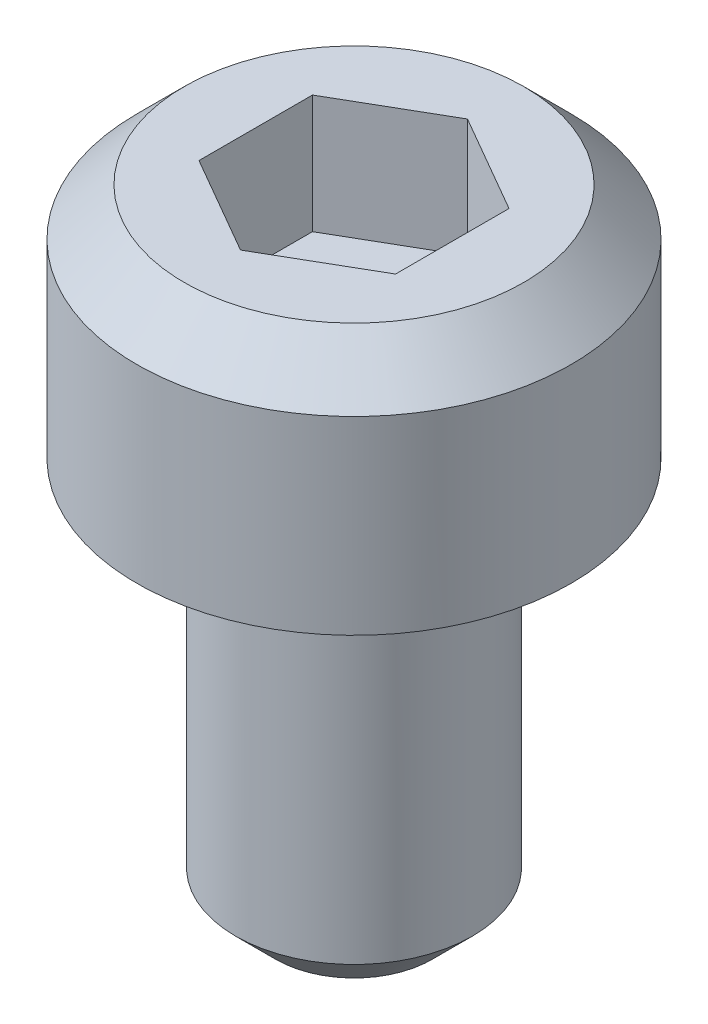
ISO-10303-21;
HEADER;
FILE_DESCRIPTION(('STEP AP214'),'2;1');
FILE_NAME('part.step','',(''),(''),'','','');
FILE_SCHEMA(('AUTOMOTIVE_DESIGN { 1 0 10303 214 1 1 1 1 }'));
ENDSEC;
DATA;
#1=APPLICATION_CONTEXT('core data for automotive mechanical design processes');
#2=APPLICATION_PROTOCOL_DEFINITION('international standard','automotive_design',2000,#1);
#3=PRODUCT_CONTEXT('',#1,'mechanical');
#4=PRODUCT('Part','Part','',(#3));
#5=PRODUCT_RELATED_PRODUCT_CATEGORY('part','',(#4));
#6=PRODUCT_DEFINITION_FORMATION('','',#4);
#7=PRODUCT_DEFINITION_CONTEXT('part definition',#1,'design');
#8=PRODUCT_DEFINITION('design','',#6,#7);
#9=PRODUCT_DEFINITION_SHAPE('','',#8);
#10=(LENGTH_UNIT() NAMED_UNIT(*) SI_UNIT(.MILLI.,.METRE.));
#11=(NAMED_UNIT(*) PLANE_ANGLE_UNIT() SI_UNIT($,.RADIAN.));
#12=(NAMED_UNIT(*) SI_UNIT($,.STERADIAN.) SOLID_ANGLE_UNIT());
#13=UNCERTAINTY_MEASURE_WITH_UNIT(LENGTH_MEASURE(1.E-05),#10,'distance_accuracy_value','');
#14=(GEOMETRIC_REPRESENTATION_CONTEXT(3) GLOBAL_UNCERTAINTY_ASSIGNED_CONTEXT((#13)) GLOBAL_UNIT_ASSIGNED_CONTEXT((#10,
#11,#12)) REPRESENTATION_CONTEXT('',''));
#15=CARTESIAN_POINT('',(0.,0.,0.));
#16=DIRECTION('',(0.,0.,1.));
#17=DIRECTION('',(1.,0.,0.));
#18=AXIS2_PLACEMENT_3D('',#15,#16,#17);
#19=CARTESIAN_POINT('',(-183.675462515959,-340.786781413598,-1451.00674798632));
#20=DIRECTION('',(0.,1.,0.));
#21=DIRECTION('',(-1.,0.,0.));
#22=AXIS2_PLACEMENT_3D('',#19,#20,#21);
#23=PLANE('',#22);
#24=DIRECTION('',(0.866025403784317,0.,0.50000000000021));
#25=VECTOR('',#24,1.);
#26=CARTESIAN_POINT('',(-184.920062515959,-340.786781413598,-1450.28817784128));
#27=LINE('',#26,#25);
#28=CARTESIAN_POINT('',(-184.920062515959,-340.786781413598,-1450.28817784128));
#29=VERTEX_POINT('',#28);
#30=CARTESIAN_POINT('',(-183.675462515959,-340.786781413598,-1449.56960769625));
#31=VERTEX_POINT('',#30);
#32=EDGE_CURVE('E129',#29,#31,#27,.T.);
#33=ORIENTED_EDGE('',*,*,#32,.T.);
#34=DIRECTION('',(0.866025403784317,0.,-0.50000000000021));
#35=VECTOR('',#34,1.);
#36=CARTESIAN_POINT('',(-183.675462515959,-340.786781413598,-1449.56960769625));
#37=LINE('',#36,#35);
#38=CARTESIAN_POINT('',(-182.430862515958,-340.786781413598,-1450.28817784129));
#39=VERTEX_POINT('',#38);
#40=EDGE_CURVE('E133',#31,#39,#37,.T.);
#41=ORIENTED_EDGE('',*,*,#40,.T.);
#42=DIRECTION('',(0.,0.,1.));
#43=VECTOR('',#42,1.);
#44=CARTESIAN_POINT('',(-182.430862515959,-340.786781413598,-1450.28817784128));
#45=LINE('',#44,#43);
#46=CARTESIAN_POINT('',(-182.430862515959,-340.786781413598,-1451.72531813135));
#47=VERTEX_POINT('',#46);
#48=EDGE_CURVE('E84',#39,#47,#45,.F.);
#49=ORIENTED_EDGE('',*,*,#48,.T.);
#50=DIRECTION('',(-0.866025403784317,0.,-0.50000000000021));
#51=VECTOR('',#50,1.);
#52=CARTESIAN_POINT('',(-182.430862515959,-340.786781413598,-1451.72531813135));
#53=LINE('',#52,#51);
#54=CARTESIAN_POINT('',(-183.67546251596,-340.786781413598,-1452.44388827639));
#55=VERTEX_POINT('',#54);
#56=EDGE_CURVE('E67',#47,#55,#53,.T.);
#57=ORIENTED_EDGE('',*,*,#56,.T.);
#58=DIRECTION('',(-0.866025403784317,0.,0.50000000000021));
#59=VECTOR('',#58,1.);
#60=CARTESIAN_POINT('',(-183.675462515959,-340.786781413598,-1452.44388827639));
#61=LINE('',#60,#59);
#62=CARTESIAN_POINT('',(-184.92006251596,-340.786781413598,-1451.72531813135));
#63=VERTEX_POINT('',#62);
#64=EDGE_CURVE('E72',#55,#63,#61,.T.);
#65=ORIENTED_EDGE('',*,*,#64,.T.);
#66=DIRECTION('',(0.,0.,1.));
#67=VECTOR('',#66,1.);
#68=CARTESIAN_POINT('',(-184.920062515959,-340.786781413598,-1451.72531813135));
#69=LINE('',#68,#67);
#70=EDGE_CURVE('E125',#63,#29,#69,.T.);
#71=ORIENTED_EDGE('',*,*,#70,.T.);
#72=EDGE_LOOP('',(#33,#41,#49,#57,#65,#71));
#73=FACE_BOUND('',#72,.T.);
#74=ADVANCED_FACE('F17',(#73),#23,.T.);
#75=CARTESIAN_POINT('',(-183.675462515959,-339.288181413598,-1452.44388827639));
#76=DIRECTION('',(-0.50000000000021,0.,-0.866025403784317));
#77=DIRECTION('',(-0.866025403784317,0.,0.50000000000021));
#78=AXIS2_PLACEMENT_3D('',#75,#76,#77);
#79=PLANE('',#78);
#80=DIRECTION('',(0.,1.,0.));
#81=VECTOR('',#80,1.);
#82=CARTESIAN_POINT('',(-183.675462515962,-339.288181413598,-1452.44388827639));
#83=LINE('',#82,#81);
#84=CARTESIAN_POINT('',(-183.67546251596,-339.288181413598,-1452.44388827639));
#85=VERTEX_POINT('',#84);
#86=EDGE_CURVE('E74',#55,#85,#83,.T.);
#87=ORIENTED_EDGE('',*,*,#86,.T.);
#88=DIRECTION('',(0.86602540378243,0.,-0.500000000003479));
#89=VECTOR('',#88,1.);
#90=CARTESIAN_POINT('',(-184.920062515959,-339.288181413598,-1451.72531813135));
#91=LINE('',#90,#89);
#92=CARTESIAN_POINT('',(-184.92006251596,-339.288181413598,-1451.72531813135));
#93=VERTEX_POINT('',#92);
#94=EDGE_CURVE('E123',#93,#85,#91,.T.);
#95=ORIENTED_EDGE('',*,*,#94,.F.);
#96=DIRECTION('',(0.,-1.,0.));
#97=VECTOR('',#96,1.);
#98=CARTESIAN_POINT('',(-184.920062515959,-339.288181413598,-1451.72531813135));
#99=LINE('',#98,#97);
#100=EDGE_CURVE('E77',#93,#63,#99,.T.);
#101=ORIENTED_EDGE('',*,*,#100,.T.);
#102=ORIENTED_EDGE('',*,*,#64,.F.);
#103=EDGE_LOOP('',(#87,#95,#101,#102));
#104=FACE_BOUND('',#103,.T.);
#105=ADVANCED_FACE('F73',(#104),#79,.F.);
#106=CARTESIAN_POINT('',(-182.430862515959,-339.288181413598,-1451.72531813135));
#107=DIRECTION('',(0.50000000000021,0.,-0.866025403784317));
#108=DIRECTION('',(-0.866025403784317,0.,-0.50000000000021));
#109=AXIS2_PLACEMENT_3D('',#106,#107,#108);
#110=PLANE('',#109);
#111=DIRECTION('',(0.,1.,0.));
#112=VECTOR('',#111,1.);
#113=CARTESIAN_POINT('',(-182.430862515959,-339.288181413598,-1451.72531813135));
#114=LINE('',#113,#112);
#115=CARTESIAN_POINT('',(-182.430862515959,-339.288181413598,-1451.72531813135));
#116=VERTEX_POINT('',#115);
#117=EDGE_CURVE('E86',#47,#116,#114,.T.);
#118=ORIENTED_EDGE('',*,*,#117,.T.);
#119=DIRECTION('',(0.866025403782435,0.,0.50000000000347));
#120=VECTOR('',#119,1.);
#121=CARTESIAN_POINT('',(-183.675462515959,-339.288181413598,-1452.44388827639));
#122=LINE('',#121,#120);
#123=EDGE_CURVE('E90',#85,#116,#122,.T.);
#124=ORIENTED_EDGE('',*,*,#123,.F.);
#125=ORIENTED_EDGE('',*,*,#86,.F.);
#126=ORIENTED_EDGE('',*,*,#56,.F.);
#127=EDGE_LOOP('',(#118,#124,#125,#126));
#128=FACE_BOUND('',#127,.T.);
#129=ADVANCED_FACE('F88',(#128),#110,.F.);
#130=CARTESIAN_POINT('',(-182.430862515959,-339.288181413598,-1450.28817784128));
#131=DIRECTION('',(1.,0.,0.));
#132=DIRECTION('',(0.,1.,0.));
#133=AXIS2_PLACEMENT_3D('',#130,#131,#132);
#134=PLANE('',#133);
#135=DIRECTION('',(0.,1.,0.));
#136=VECTOR('',#135,1.);
#137=CARTESIAN_POINT('',(-182.430862515956,-339.288181413598,-1450.28817784129));
#138=LINE('',#137,#136);
#139=CARTESIAN_POINT('',(-182.430862515958,-339.288181413598,-1450.28817784129));
#140=VERTEX_POINT('',#139);
#141=EDGE_CURVE('E135',#39,#140,#138,.T.);
#142=ORIENTED_EDGE('',*,*,#141,.T.);
#143=DIRECTION('',(0.,0.,1.));
#144=VECTOR('',#143,1.);
#145=CARTESIAN_POINT('',(-182.430862515959,-339.288181413598,-1451.00674798632));
#146=LINE('',#145,#144);
#147=EDGE_CURVE('E119',#116,#140,#146,.T.);
#148=ORIENTED_EDGE('',*,*,#147,.F.);
#149=ORIENTED_EDGE('',*,*,#117,.F.);
#150=ORIENTED_EDGE('',*,*,#48,.F.);
#151=EDGE_LOOP('',(#142,#148,#149,#150));
#152=FACE_BOUND('',#151,.T.);
#153=ADVANCED_FACE('F139',(#152),#134,.F.);
#154=CARTESIAN_POINT('',(-183.675462515959,-339.288181413598,-1449.56960769625));
#155=DIRECTION('',(0.50000000000021,0.,0.866025403784317));
#156=DIRECTION('',(0.866025403784317,0.,-0.50000000000021));
#157=AXIS2_PLACEMENT_3D('',#154,#155,#156);
#158=PLANE('',#157);
#159=DIRECTION('',(0.,1.,0.));
#160=VECTOR('',#159,1.);
#161=CARTESIAN_POINT('',(-183.675462515961,-339.288181413598,-1449.56960769625));
#162=LINE('',#161,#160);
#163=CARTESIAN_POINT('',(-183.675462515959,-339.288181413598,-1449.56960769625));
#164=VERTEX_POINT('',#163);
#165=EDGE_CURVE('E131',#31,#164,#162,.T.);
#166=ORIENTED_EDGE('',*,*,#165,.T.);
#167=DIRECTION('',(-0.866025403782435,0.,0.50000000000347));
#168=VECTOR('',#167,1.);
#169=CARTESIAN_POINT('',(-182.430862515959,-339.288181413598,-1450.28817784129));
#170=LINE('',#169,#168);
#171=EDGE_CURVE('E116',#140,#164,#170,.T.);
#172=ORIENTED_EDGE('',*,*,#171,.F.);
#173=ORIENTED_EDGE('',*,*,#141,.F.);
#174=ORIENTED_EDGE('',*,*,#40,.F.);
#175=EDGE_LOOP('',(#166,#172,#173,#174));
#176=FACE_BOUND('',#175,.T.);
#177=ADVANCED_FACE('F150',(#176),#158,.F.);
#178=CARTESIAN_POINT('',(-184.920062515959,-339.288181413598,-1450.28817784128));
#179=DIRECTION('',(-0.50000000000021,0.,0.866025403784317));
#180=DIRECTION('',(0.866025403784317,0.,0.50000000000021));
#181=AXIS2_PLACEMENT_3D('',#178,#179,#180);
#182=PLANE('',#181);
#183=DIRECTION('',(0.,-1.,0.));
#184=VECTOR('',#183,1.);
#185=CARTESIAN_POINT('',(-184.920062515959,-339.288181413598,-1450.28817784128));
#186=LINE('',#185,#184);
#187=CARTESIAN_POINT('',(-184.920062515959,-339.288181413598,-1450.28817784128));
#188=VERTEX_POINT('',#187);
#189=EDGE_CURVE('E35',#29,#188,#186,.F.);
#190=ORIENTED_EDGE('',*,*,#189,.T.);
#191=DIRECTION('',(-0.866025403785441,0.,-0.499999999998264));
#192=VECTOR('',#191,1.);
#193=CARTESIAN_POINT('',(-183.675462515959,-339.288181413598,-1449.56960769625));
#194=LINE('',#193,#192);
#195=EDGE_CURVE('E113',#164,#188,#194,.T.);
#196=ORIENTED_EDGE('',*,*,#195,.F.);
#197=ORIENTED_EDGE('',*,*,#165,.F.);
#198=ORIENTED_EDGE('',*,*,#32,.F.);
#199=EDGE_LOOP('',(#190,#196,#197,#198));
#200=FACE_BOUND('',#199,.T.);
#201=ADVANCED_FACE('F148',(#200),#182,.F.);
#202=CARTESIAN_POINT('',(-184.920062515959,-339.288181413598,-1451.72531813135));
#203=DIRECTION('',(-1.,0.,0.));
#204=DIRECTION('',(0.,-1.,0.));
#205=AXIS2_PLACEMENT_3D('',#202,#203,#204);
#206=PLANE('',#205);
#207=ORIENTED_EDGE('',*,*,#100,.F.);
#208=DIRECTION('',(0.,0.,1.));
#209=VECTOR('',#208,1.);
#210=CARTESIAN_POINT('',(-184.920062515959,-339.288181413598,-1451.00674798632));
#211=LINE('',#210,#209);
#212=EDGE_CURVE('E109',#188,#93,#211,.F.);
#213=ORIENTED_EDGE('',*,*,#212,.F.);
#214=ORIENTED_EDGE('',*,*,#189,.F.);
#215=ORIENTED_EDGE('',*,*,#70,.F.);
#216=EDGE_LOOP('',(#207,#213,#214,#215));
#217=FACE_BOUND('',#216,.T.);
#218=ADVANCED_FACE('F146',(#217),#206,.F.);
#219=CARTESIAN_POINT('',(-183.675462515959,-339.288181413598,-1451.00674798632));
#220=DIRECTION('',(0.,1.,0.));
#221=DIRECTION('',(-1.,0.,0.));
#222=AXIS2_PLACEMENT_3D('',#219,#220,#221);
#223=PLANE('',#222);
#224=ORIENTED_EDGE('',*,*,#195,.T.);
#225=ORIENTED_EDGE('',*,*,#212,.T.);
#226=ORIENTED_EDGE('',*,*,#94,.T.);
#227=ORIENTED_EDGE('',*,*,#123,.T.);
#228=ORIENTED_EDGE('',*,*,#147,.T.);
#229=ORIENTED_EDGE('',*,*,#171,.T.);
#230=EDGE_LOOP('',(#224,#225,#226,#227,#228,#229));
#231=FACE_BOUND('',#230,.T.);
#232=CARTESIAN_POINT('',(-183.675462515959,-339.288181413591,-1451.00674798632));
#233=DIRECTION('',(0.,-1.,0.));
#234=DIRECTION('',(0.,0.,-1.));
#235=AXIS2_PLACEMENT_3D('',#232,#233,#234);
#236=CIRCLE('',#235,2.14960199997405);
#237=CARTESIAN_POINT('',(-183.675462515959,-339.288181413591,-1453.15634998629));
#238=VERTEX_POINT('',#237);
#239=EDGE_CURVE('E20',#238,#238,#236,.T.);
#240=ORIENTED_EDGE('',*,*,#239,.F.);
#241=EDGE_LOOP('',(#240));
#242=FACE_BOUND('',#241,.T.);
#243=ADVANCED_FACE('F143',(#231,#242),#223,.T.);
#244=CARTESIAN_POINT('',(-183.675462515959,-339.888129413607,-1451.00674798632));
#245=DIRECTION('',(0.,-1.,0.));
#246=DIRECTION('',(0.,0.,-1.));
#247=AXIS2_PLACEMENT_3D('',#244,#245,#246);
#248=CONICAL_SURFACE('',#247,2.7495499999905,0.785398163397448);
#249=ORIENTED_EDGE('',*,*,#239,.T.);
#250=EDGE_LOOP('',(#249));
#251=FACE_BOUND('',#250,.T.);
#252=CARTESIAN_POINT('',(-183.675462515959,-339.888129413617,-1451.00674798632));
#253=DIRECTION('',(0.,1.,0.));
#254=DIRECTION('',(-1.,0.,0.));
#255=AXIS2_PLACEMENT_3D('',#252,#253,#254);
#256=CIRCLE('',#255,2.74955);
#257=CARTESIAN_POINT('',(-186.425012515959,-339.888129413617,-1451.00674798632));
#258=VERTEX_POINT('',#257);
#259=EDGE_CURVE('E101',#258,#258,#256,.F.);
#260=ORIENTED_EDGE('',*,*,#259,.F.);
#261=EDGE_LOOP('',(#260));
#262=FACE_BOUND('',#261,.T.);
#263=ADVANCED_FACE('F183',(#251,#262),#248,.T.);
#264=CARTESIAN_POINT('',(-183.675462515959,-342.287921413598,-1451.00674798632));
#265=DIRECTION('',(0.,1.,0.));
#266=DIRECTION('',(-1.,0.,0.));
#267=AXIS2_PLACEMENT_3D('',#264,#265,#266);
#268=CYLINDRICAL_SURFACE('',#267,2.74955);
#269=ORIENTED_EDGE('',*,*,#259,.T.);
#270=EDGE_LOOP('',(#269));
#271=FACE_BOUND('',#270,.T.);
#272=CARTESIAN_POINT('',(-183.675462515959,-342.287921413598,-1451.00674798632));
#273=DIRECTION('',(0.,1.,0.));
#274=DIRECTION('',(-1.,0.,0.));
#275=AXIS2_PLACEMENT_3D('',#272,#273,#274);
#276=CIRCLE('',#275,2.74955);
#277=CARTESIAN_POINT('',(-186.425012515959,-342.287921413598,-1451.00674798632));
#278=VERTEX_POINT('',#277);
#279=EDGE_CURVE('E99',#278,#278,#276,.T.);
#280=ORIENTED_EDGE('',*,*,#279,.T.);
#281=EDGE_LOOP('',(#280));
#282=FACE_BOUND('',#281,.T.);
#283=ADVANCED_FACE('F179',(#271,#282),#268,.T.);
#284=CARTESIAN_POINT('',(-183.675462515959,-347.289181413598,-1451.00674798632));
#285=DIRECTION('',(0.,-1.,0.));
#286=DIRECTION('',(1.,0.,0.));
#287=AXIS2_PLACEMENT_3D('',#284,#285,#286);
#288=PLANE('',#287);
#289=CARTESIAN_POINT('',(-183.675462515959,-347.289181413584,-1451.00674798632));
#290=DIRECTION('',(0.,1.,0.));
#291=DIRECTION('',(0.,0.,1.));
#292=AXIS2_PLACEMENT_3D('',#289,#290,#291);
#293=CIRCLE('',#292,0.991869999992012);
#294=CARTESIAN_POINT('',(-183.675462515959,-347.289181413584,-1450.01487798633));
#295=VERTEX_POINT('',#294);
#296=EDGE_CURVE('E97',#295,#295,#293,.T.);
#297=ORIENTED_EDGE('',*,*,#296,.F.);
#298=EDGE_LOOP('',(#297));
#299=FACE_BOUND('',#298,.T.);
#300=ADVANCED_FACE('F175',(#299),#288,.T.);
#301=CARTESIAN_POINT('',(-183.675462515959,-342.287921413598,-1451.00674798632));
#302=DIRECTION('',(0.,1.,0.));
#303=DIRECTION('',(-1.,0.,0.));
#304=AXIS2_PLACEMENT_3D('',#301,#302,#303);
#305=PLANE('',#304);
#306=CARTESIAN_POINT('',(-183.675462515959,-342.287921413598,-1451.00674798632));
#307=DIRECTION('',(0.,-1.,0.));
#308=DIRECTION('',(1.,0.,0.));
#309=AXIS2_PLACEMENT_3D('',#306,#307,#308);
#310=CIRCLE('',#309,1.49987);
#311=CARTESIAN_POINT('',(-182.175592515959,-342.287921413598,-1451.00674798632));
#312=VERTEX_POINT('',#311);
#313=EDGE_CURVE('E26',#312,#312,#310,.T.);
#314=ORIENTED_EDGE('',*,*,#313,.F.);
#315=EDGE_LOOP('',(#314));
#316=FACE_BOUND('',#315,.T.);
#317=ORIENTED_EDGE('',*,*,#279,.F.);
#318=EDGE_LOOP('',(#317));
#319=FACE_BOUND('',#318,.T.);
#320=ADVANCED_FACE('F168',(#316,#319),#305,.F.);
#321=CARTESIAN_POINT('',(-183.675462515959,-346.781181413576,-1451.00674798632));
#322=DIRECTION('',(0.,1.,0.));
#323=DIRECTION('',(0.,0.,1.));
#324=AXIS2_PLACEMENT_3D('',#321,#322,#323);
#325=CONICAL_SURFACE('',#324,1.49987000000001,0.785398163397448);
#326=CARTESIAN_POINT('',(-183.675462515959,-346.781181413587,-1451.00674798632));
#327=DIRECTION('',(0.,-1.,0.));
#328=DIRECTION('',(1.,0.,0.));
#329=AXIS2_PLACEMENT_3D('',#326,#327,#328);
#330=CIRCLE('',#329,1.49987);
#331=CARTESIAN_POINT('',(-182.175592515959,-346.781181413587,-1451.00674798632));
#332=VERTEX_POINT('',#331);
#333=EDGE_CURVE('E11',#332,#332,#330,.F.);
#334=ORIENTED_EDGE('',*,*,#333,.F.);
#335=EDGE_LOOP('',(#334));
#336=FACE_BOUND('',#335,.T.);
#337=ORIENTED_EDGE('',*,*,#296,.T.);
#338=EDGE_LOOP('',(#337));
#339=FACE_BOUND('',#338,.T.);
#340=ADVANCED_FACE('F162',(#336,#339),#325,.T.);
#341=CARTESIAN_POINT('',(-183.675462515959,-342.287921413598,-1451.00674798632));
#342=DIRECTION('',(0.,-1.,0.));
#343=DIRECTION('',(1.,0.,0.));
#344=AXIS2_PLACEMENT_3D('',#341,#342,#343);
#345=CYLINDRICAL_SURFACE('',#344,1.49987);
#346=ORIENTED_EDGE('',*,*,#333,.T.);
#347=EDGE_LOOP('',(#346));
#348=FACE_BOUND('',#347,.T.);
#349=ORIENTED_EDGE('',*,*,#313,.T.);
#350=EDGE_LOOP('',(#349));
#351=FACE_BOUND('',#350,.T.);
#352=ADVANCED_FACE('F160',(#348,#351),#345,.T.);
#353=CLOSED_SHELL('',(#74,#105,#129,#153,#177,#201,#218,#243,#263,#283,#300,#320,#340,#352));
#354=MANIFOLD_SOLID_BREP('B1',#353);
#355=ADVANCED_BREP_SHAPE_REPRESENTATION('',(#18,#354),#14);
#356=SHAPE_DEFINITION_REPRESENTATION(#9,#355);
ENDSEC;
END-ISO-10303-21;
